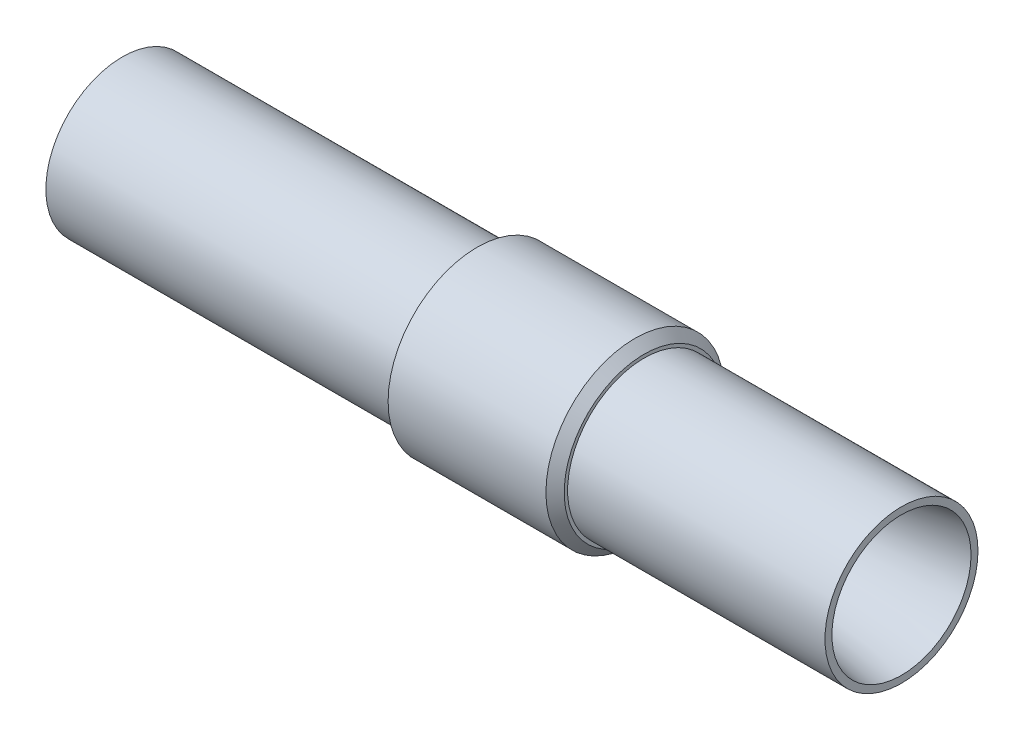
ISO-10303-21;
HEADER;
FILE_DESCRIPTION(('STEP AP214'),'2;1');
FILE_NAME('part.step','',(''),(''),'','','');
FILE_SCHEMA(('AUTOMOTIVE_DESIGN { 1 0 10303 214 1 1 1 1 }'));
ENDSEC;
DATA;
#1=APPLICATION_CONTEXT('core data for automotive mechanical design processes');
#2=APPLICATION_PROTOCOL_DEFINITION('international standard','automotive_design',2000,#1);
#3=PRODUCT_CONTEXT('',#1,'mechanical');
#4=PRODUCT('Part','Part','',(#3));
#5=PRODUCT_RELATED_PRODUCT_CATEGORY('part','',(#4));
#6=PRODUCT_DEFINITION_FORMATION('','',#4);
#7=PRODUCT_DEFINITION_CONTEXT('part definition',#1,'design');
#8=PRODUCT_DEFINITION('design','',#6,#7);
#9=PRODUCT_DEFINITION_SHAPE('','',#8);
#10=(LENGTH_UNIT() NAMED_UNIT(*) SI_UNIT(.MILLI.,.METRE.));
#11=(NAMED_UNIT(*) PLANE_ANGLE_UNIT() SI_UNIT($,.RADIAN.));
#12=(NAMED_UNIT(*) SI_UNIT($,.STERADIAN.) SOLID_ANGLE_UNIT());
#13=UNCERTAINTY_MEASURE_WITH_UNIT(LENGTH_MEASURE(1.E-05),#10,'distance_accuracy_value','');
#14=(GEOMETRIC_REPRESENTATION_CONTEXT(3) GLOBAL_UNCERTAINTY_ASSIGNED_CONTEXT((#13)) GLOBAL_UNIT_ASSIGNED_CONTEXT((#10,
#11,#12)) REPRESENTATION_CONTEXT('',''));
#15=CARTESIAN_POINT('',(0.,0.,0.));
#16=DIRECTION('',(0.,0.,1.));
#17=DIRECTION('',(1.,0.,0.));
#18=AXIS2_PLACEMENT_3D('',#15,#16,#17);
#19=CARTESIAN_POINT('',(0.,0.,0.));
#20=DIRECTION('',(1.,0.,0.));
#21=DIRECTION('',(0.,0.,-1.));
#22=AXIS2_PLACEMENT_3D('',#19,#20,#21);
#23=CYLINDRICAL_SURFACE('',#22,27.5);
#24=CARTESIAN_POINT('',(-280.,0.,0.));
#25=DIRECTION('',(1.,0.,0.));
#26=DIRECTION('',(0.,0.,-1.));
#27=AXIS2_PLACEMENT_3D('',#24,#25,#26);
#28=CIRCLE('',#27,27.5);
#29=CARTESIAN_POINT('',(-280.,0.,-27.5));
#30=VERTEX_POINT('',#29);
#31=EDGE_CURVE('E63',#30,#30,#28,.T.);
#32=ORIENTED_EDGE('',*,*,#31,.T.);
#33=EDGE_LOOP('',(#32));
#34=FACE_BOUND('',#33,.T.);
#35=CARTESIAN_POINT('',(-152.5,0.,0.));
#36=DIRECTION('',(1.,0.,0.));
#37=DIRECTION('',(0.,0.,-1.));
#38=AXIS2_PLACEMENT_3D('',#35,#36,#37);
#39=CIRCLE('',#38,27.5);
#40=CARTESIAN_POINT('',(-152.5,0.,-27.5));
#41=VERTEX_POINT('',#40);
#42=EDGE_CURVE('E72',#41,#41,#39,.T.);
#43=ORIENTED_EDGE('',*,*,#42,.F.);
#44=EDGE_LOOP('',(#43));
#45=FACE_BOUND('',#44,.T.);
#46=ADVANCED_FACE('F34',(#34,#45),#23,.T.);
#47=CARTESIAN_POINT('',(0.,27.5,0.));
#48=DIRECTION('',(1.,0.,0.));
#49=DIRECTION('',(0.,0.,-1.));
#50=AXIS2_PLACEMENT_3D('',#47,#48,#49);
#51=PLANE('',#50);
#52=CARTESIAN_POINT('',(0.,0.,0.));
#53=DIRECTION('',(1.,0.,0.));
#54=DIRECTION('',(0.,0.,-1.));
#55=AXIS2_PLACEMENT_3D('',#52,#53,#54);
#56=CIRCLE('',#55,27.5);
#57=CARTESIAN_POINT('',(0.,0.,-27.5));
#58=VERTEX_POINT('',#57);
#59=EDGE_CURVE('E66',#58,#58,#56,.T.);
#60=ORIENTED_EDGE('',*,*,#59,.T.);
#61=EDGE_LOOP('',(#60));
#62=FACE_BOUND('',#61,.T.);
#63=CARTESIAN_POINT('',(0.,0.,0.));
#64=DIRECTION('',(1.,0.,0.));
#65=DIRECTION('',(0.,0.,-1.));
#66=AXIS2_PLACEMENT_3D('',#63,#64,#65);
#67=CIRCLE('',#66,25.);
#68=CARTESIAN_POINT('',(0.,0.,-25.));
#69=VERTEX_POINT('',#68);
#70=EDGE_CURVE('E49',#69,#69,#67,.T.);
#71=ORIENTED_EDGE('',*,*,#70,.F.);
#72=EDGE_LOOP('',(#71));
#73=FACE_BOUND('',#72,.T.);
#74=ADVANCED_FACE('F79',(#62,#73),#51,.T.);
#75=CARTESIAN_POINT('',(-77.5,0.,0.));
#76=DIRECTION('',(1.,0.,0.));
#77=DIRECTION('',(0.,0.,-1.));
#78=AXIS2_PLACEMENT_3D('',#75,#76,#77);
#79=CONICAL_SURFACE('',#78,12.5,0.159913123158219);
#80=ORIENTED_EDGE('',*,*,#70,.T.);
#81=EDGE_LOOP('',(#80));
#82=FACE_BOUND('',#81,.T.);
#83=CARTESIAN_POINT('',(-77.5,0.,0.));
#84=DIRECTION('',(1.,0.,0.));
#85=DIRECTION('',(0.,0.,-1.));
#86=AXIS2_PLACEMENT_3D('',#83,#84,#85);
#87=CIRCLE('',#86,12.5);
#88=CARTESIAN_POINT('',(-77.5,0.,-12.5));
#89=VERTEX_POINT('',#88);
#90=EDGE_CURVE('E54',#89,#89,#87,.T.);
#91=ORIENTED_EDGE('',*,*,#90,.F.);
#92=EDGE_LOOP('',(#91));
#93=FACE_BOUND('',#92,.T.);
#94=ADVANCED_FACE('F86',(#82,#93),#79,.F.);
#95=CARTESIAN_POINT('',(0.,0.,0.));
#96=DIRECTION('',(1.,0.,0.));
#97=DIRECTION('',(0.,0.,-1.));
#98=AXIS2_PLACEMENT_3D('',#95,#96,#97);
#99=CYLINDRICAL_SURFACE('',#98,12.5);
#100=ORIENTED_EDGE('',*,*,#90,.T.);
#101=EDGE_LOOP('',(#100));
#102=FACE_BOUND('',#101,.T.);
#103=CARTESIAN_POINT('',(-145.,0.,0.));
#104=DIRECTION('',(1.,0.,0.));
#105=DIRECTION('',(0.,0.,-1.));
#106=AXIS2_PLACEMENT_3D('',#103,#104,#105);
#107=CIRCLE('',#106,12.5);
#108=CARTESIAN_POINT('',(-145.,0.,-12.5));
#109=VERTEX_POINT('',#108);
#110=EDGE_CURVE('E57',#109,#109,#107,.T.);
#111=ORIENTED_EDGE('',*,*,#110,.F.);
#112=EDGE_LOOP('',(#111));
#113=FACE_BOUND('',#112,.T.);
#114=ADVANCED_FACE('F109',(#102,#113),#99,.F.);
#115=CARTESIAN_POINT('',(-280.,0.,0.));
#116=DIRECTION('',(-1.,0.,0.));
#117=DIRECTION('',(0.,0.,1.));
#118=AXIS2_PLACEMENT_3D('',#115,#116,#117);
#119=CONICAL_SURFACE('',#118,25.,0.0923293347315989);
#120=ORIENTED_EDGE('',*,*,#110,.T.);
#121=EDGE_LOOP('',(#120));
#122=FACE_BOUND('',#121,.T.);
#123=CARTESIAN_POINT('',(-280.,0.,0.));
#124=DIRECTION('',(1.,0.,0.));
#125=DIRECTION('',(0.,0.,-1.));
#126=AXIS2_PLACEMENT_3D('',#123,#124,#125);
#127=CIRCLE('',#126,25.);
#128=CARTESIAN_POINT('',(-280.,0.,-25.));
#129=VERTEX_POINT('',#128);
#130=EDGE_CURVE('E60',#129,#129,#127,.T.);
#131=ORIENTED_EDGE('',*,*,#130,.F.);
#132=EDGE_LOOP('',(#131));
#133=FACE_BOUND('',#132,.T.);
#134=ADVANCED_FACE('F99',(#122,#133),#119,.F.);
#135=CARTESIAN_POINT('',(-280.,27.5,0.));
#136=DIRECTION('',(-1.,0.,0.));
#137=DIRECTION('',(0.,0.,1.));
#138=AXIS2_PLACEMENT_3D('',#135,#136,#137);
#139=PLANE('',#138);
#140=ORIENTED_EDGE('',*,*,#130,.T.);
#141=EDGE_LOOP('',(#140));
#142=FACE_BOUND('',#141,.T.);
#143=ORIENTED_EDGE('',*,*,#31,.F.);
#144=EDGE_LOOP('',(#143));
#145=FACE_BOUND('',#144,.T.);
#146=ADVANCED_FACE('F92',(#142,#145),#139,.T.);
#147=CARTESIAN_POINT('',(-92.5,0.,0.));
#148=DIRECTION('',(1.,0.,0.));
#149=DIRECTION('',(0.,0.,-1.));
#150=AXIS2_PLACEMENT_3D('',#147,#148,#149);
#151=CIRCLE('',#150,27.5);
#152=CARTESIAN_POINT('',(-92.5,0.,-27.5));
#153=VERTEX_POINT('',#152);
#154=EDGE_CURVE('E45',#153,#153,#151,.F.);
#155=ORIENTED_EDGE('',*,*,#154,.F.);
#156=EDGE_LOOP('',(#155));
#157=FACE_BOUND('',#156,.T.);
#158=ORIENTED_EDGE('',*,*,#59,.F.);
#159=EDGE_LOOP('',(#158));
#160=FACE_BOUND('',#159,.T.);
#161=ADVANCED_FACE('F82',(#157,#160),#23,.T.);
#162=CARTESIAN_POINT('',(-92.5,0.,0.));
#163=DIRECTION('',(1.,0.,0.));
#164=DIRECTION('',(0.,0.,-1.));
#165=AXIS2_PLACEMENT_3D('',#162,#163,#164);
#166=PLANE('',#165);
#167=CARTESIAN_POINT('',(-92.5,0.,0.));
#168=DIRECTION('',(1.,0.,0.));
#169=DIRECTION('',(0.,0.,-1.));
#170=AXIS2_PLACEMENT_3D('',#167,#168,#169);
#171=CIRCLE('',#170,28.7125000000001);
#172=CARTESIAN_POINT('',(-92.5,0.,-28.7125000000001));
#173=VERTEX_POINT('',#172);
#174=EDGE_CURVE('E41',#173,#173,#171,.T.);
#175=ORIENTED_EDGE('',*,*,#174,.T.);
#176=EDGE_LOOP('',(#175));
#177=FACE_BOUND('',#176,.T.);
#178=ORIENTED_EDGE('',*,*,#154,.T.);
#179=EDGE_LOOP('',(#178));
#180=FACE_BOUND('',#179,.T.);
#181=ADVANCED_FACE('F91',(#177,#180),#166,.T.);
#182=CARTESIAN_POINT('',(-152.5,0.,0.));
#183=DIRECTION('',(1.,0.,0.));
#184=DIRECTION('',(0.,0.,-1.));
#185=AXIS2_PLACEMENT_3D('',#182,#183,#184);
#186=PLANE('',#185);
#187=CARTESIAN_POINT('',(-152.5,0.,0.));
#188=DIRECTION('',(1.,0.,0.));
#189=DIRECTION('',(0.,0.,-1.));
#190=AXIS2_PLACEMENT_3D('',#187,#188,#189);
#191=CIRCLE('',#190,32.);
#192=CARTESIAN_POINT('',(-152.5,0.,-32.));
#193=VERTEX_POINT('',#192);
#194=EDGE_CURVE('E69',#193,#193,#191,.T.);
#195=ORIENTED_EDGE('',*,*,#194,.F.);
#196=EDGE_LOOP('',(#195));
#197=FACE_BOUND('',#196,.T.);
#198=ORIENTED_EDGE('',*,*,#42,.T.);
#199=EDGE_LOOP('',(#198));
#200=FACE_BOUND('',#199,.T.);
#201=ADVANCED_FACE('F76',(#197,#200),#186,.F.);
#202=CARTESIAN_POINT('',(-92.5,0.,0.));
#203=DIRECTION('',(-1.,0.,0.));
#204=DIRECTION('',(0.,0.,1.));
#205=AXIS2_PLACEMENT_3D('',#202,#203,#204);
#206=CYLINDRICAL_SURFACE('',#205,32.);
#207=CARTESIAN_POINT('',(-95.7875,0.,0.));
#208=DIRECTION('',(1.,0.,0.));
#209=DIRECTION('',(0.,0.,-1.));
#210=AXIS2_PLACEMENT_3D('',#207,#208,#209);
#211=CIRCLE('',#210,32.);
#212=CARTESIAN_POINT('',(-95.7875,0.,-32.));
#213=VERTEX_POINT('',#212);
#214=EDGE_CURVE('E10',#213,#213,#211,.F.);
#215=ORIENTED_EDGE('',*,*,#214,.T.);
#216=EDGE_LOOP('',(#215));
#217=FACE_BOUND('',#216,.T.);
#218=ORIENTED_EDGE('',*,*,#194,.T.);
#219=EDGE_LOOP('',(#218));
#220=FACE_BOUND('',#219,.T.);
#221=ADVANCED_FACE('F152',(#217,#220),#206,.T.);
#222=CARTESIAN_POINT('',(-92.5,0.,0.));
#223=DIRECTION('',(-1.,0.,0.));
#224=DIRECTION('',(0.,0.,1.));
#225=AXIS2_PLACEMENT_3D('',#222,#223,#224);
#226=CONICAL_SURFACE('',#225,28.7125000000001,0.785398163397444);
#227=ORIENTED_EDGE('',*,*,#214,.F.);
#228=EDGE_LOOP('',(#227));
#229=FACE_BOUND('',#228,.T.);
#230=ORIENTED_EDGE('',*,*,#174,.F.);
#231=EDGE_LOOP('',(#230));
#232=FACE_BOUND('',#231,.T.);
#233=ADVANCED_FACE('F36',(#229,#232),#226,.T.);
#234=CLOSED_SHELL('',(#46,#74,#94,#114,#134,#146,#161,#181,#201,#221,#233));
#235=MANIFOLD_SOLID_BREP('B2',#234);
#236=ADVANCED_BREP_SHAPE_REPRESENTATION('',(#18,#235),#14);
#237=SHAPE_DEFINITION_REPRESENTATION(#9,#236);
ENDSEC;
END-ISO-10303-21;
